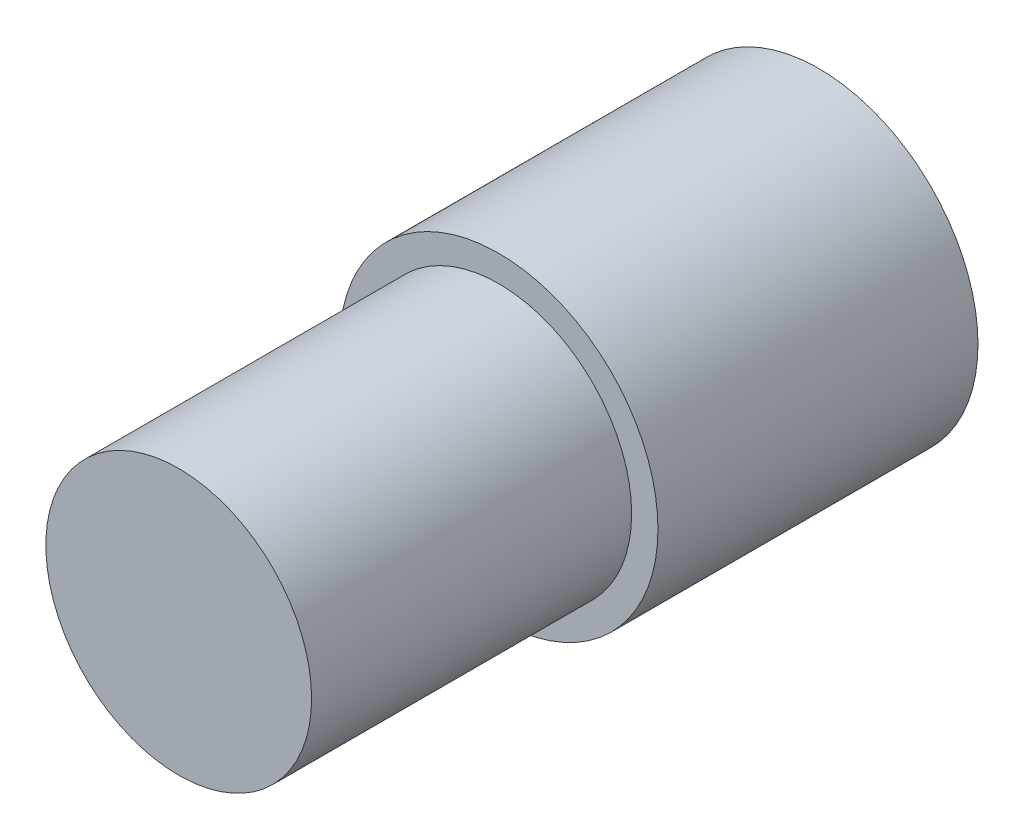
ISO-10303-21;
HEADER;
FILE_DESCRIPTION(('STEP AP214'),'2;1');
FILE_NAME('part.step','',(''),(''),'','','');
FILE_SCHEMA(('AUTOMOTIVE_DESIGN { 1 0 10303 214 1 1 1 1 }'));
ENDSEC;
DATA;
#1=APPLICATION_CONTEXT('core data for automotive mechanical design processes');
#2=APPLICATION_PROTOCOL_DEFINITION('international standard','automotive_design',2000,#1);
#3=PRODUCT_CONTEXT('',#1,'mechanical');
#4=PRODUCT('Part','Part','',(#3));
#5=PRODUCT_RELATED_PRODUCT_CATEGORY('part','',(#4));
#6=PRODUCT_DEFINITION_FORMATION('','',#4);
#7=PRODUCT_DEFINITION_CONTEXT('part definition',#1,'design');
#8=PRODUCT_DEFINITION('design','',#6,#7);
#9=PRODUCT_DEFINITION_SHAPE('','',#8);
#10=(LENGTH_UNIT() NAMED_UNIT(*) SI_UNIT(.MILLI.,.METRE.));
#11=(NAMED_UNIT(*) PLANE_ANGLE_UNIT() SI_UNIT($,.RADIAN.));
#12=(NAMED_UNIT(*) SI_UNIT($,.STERADIAN.) SOLID_ANGLE_UNIT());
#13=UNCERTAINTY_MEASURE_WITH_UNIT(LENGTH_MEASURE(1.E-05),#10,'distance_accuracy_value','');
#14=(GEOMETRIC_REPRESENTATION_CONTEXT(3) GLOBAL_UNCERTAINTY_ASSIGNED_CONTEXT((#13)) GLOBAL_UNIT_ASSIGNED_CONTEXT((#10,
#11,#12)) REPRESENTATION_CONTEXT('',''));
#15=CARTESIAN_POINT('',(0.,0.,0.));
#16=DIRECTION('',(0.,0.,1.));
#17=DIRECTION('',(1.,0.,0.));
#18=AXIS2_PLACEMENT_3D('',#15,#16,#17);
#19=CARTESIAN_POINT('',(0.,0.,10.));
#20=DIRECTION('',(0.,0.,-1.));
#21=DIRECTION('',(-1.,0.,0.));
#22=AXIS2_PLACEMENT_3D('',#19,#20,#21);
#23=CYLINDRICAL_SURFACE('',#22,4.975);
#24=CARTESIAN_POINT('',(0.,0.,10.));
#25=DIRECTION('',(0.,0.,1.));
#26=DIRECTION('',(1.,0.,0.));
#27=AXIS2_PLACEMENT_3D('',#24,#25,#26);
#28=CIRCLE('',#27,4.975);
#29=CARTESIAN_POINT('',(4.975,0.,10.));
#30=VERTEX_POINT('',#29);
#31=EDGE_CURVE('E44',#30,#30,#28,.T.);
#32=ORIENTED_EDGE('',*,*,#31,.F.);
#33=EDGE_LOOP('',(#32));
#34=FACE_BOUND('',#33,.T.);
#35=CARTESIAN_POINT('',(0.,0.,0.));
#36=DIRECTION('',(0.,0.,1.));
#37=DIRECTION('',(1.,0.,0.));
#38=AXIS2_PLACEMENT_3D('',#35,#36,#37);
#39=CIRCLE('',#38,4.975);
#40=CARTESIAN_POINT('',(4.975,0.,0.));
#41=VERTEX_POINT('',#40);
#42=EDGE_CURVE('E40',#41,#41,#39,.T.);
#43=ORIENTED_EDGE('',*,*,#42,.T.);
#44=EDGE_LOOP('',(#43));
#45=FACE_BOUND('',#44,.T.);
#46=ADVANCED_FACE('F37',(#34,#45),#23,.T.);
#47=CARTESIAN_POINT('',(0.,0.,10.));
#48=DIRECTION('',(0.,0.,1.));
#49=DIRECTION('',(1.,0.,0.));
#50=AXIS2_PLACEMENT_3D('',#47,#48,#49);
#51=PLANE('',#50);
#52=CARTESIAN_POINT('',(0.,0.,10.));
#53=DIRECTION('',(0.,0.,1.));
#54=DIRECTION('',(1.,0.,0.));
#55=AXIS2_PLACEMENT_3D('',#52,#53,#54);
#56=CIRCLE('',#55,4.1520075664446);
#57=CARTESIAN_POINT('',(4.1520075664446,0.,10.));
#58=VERTEX_POINT('',#57);
#59=EDGE_CURVE('E10',#58,#58,#56,.T.);
#60=ORIENTED_EDGE('',*,*,#59,.F.);
#61=EDGE_LOOP('',(#60));
#62=FACE_BOUND('',#61,.T.);
#63=ORIENTED_EDGE('',*,*,#31,.T.);
#64=EDGE_LOOP('',(#63));
#65=FACE_BOUND('',#64,.T.);
#66=ADVANCED_FACE('F61',(#62,#65),#51,.T.);
#67=CARTESIAN_POINT('',(0.,0.,0.));
#68=DIRECTION('',(0.,0.,1.));
#69=DIRECTION('',(1.,0.,0.));
#70=AXIS2_PLACEMENT_3D('',#67,#68,#69);
#71=PLANE('',#70);
#72=ORIENTED_EDGE('',*,*,#42,.F.);
#73=EDGE_LOOP('',(#72));
#74=FACE_BOUND('',#73,.T.);
#75=ADVANCED_FACE('F58',(#74),#71,.F.);
#76=CARTESIAN_POINT('',(0.,0.,20.));
#77=DIRECTION('',(0.,0.,-1.));
#78=DIRECTION('',(-1.,0.,0.));
#79=AXIS2_PLACEMENT_3D('',#76,#77,#78);
#80=CYLINDRICAL_SURFACE('',#79,4.1520075664446);
#81=CARTESIAN_POINT('',(0.,0.,20.));
#82=DIRECTION('',(0.,0.,1.));
#83=DIRECTION('',(1.,0.,0.));
#84=AXIS2_PLACEMENT_3D('',#81,#82,#83);
#85=CIRCLE('',#84,4.1520075664446);
#86=CARTESIAN_POINT('',(4.1520075664446,0.,20.));
#87=VERTEX_POINT('',#86);
#88=EDGE_CURVE('E50',#87,#87,#85,.T.);
#89=ORIENTED_EDGE('',*,*,#88,.F.);
#90=EDGE_LOOP('',(#89));
#91=FACE_BOUND('',#90,.T.);
#92=ORIENTED_EDGE('',*,*,#59,.T.);
#93=EDGE_LOOP('',(#92));
#94=FACE_BOUND('',#93,.T.);
#95=ADVANCED_FACE('F60',(#91,#94),#80,.T.);
#96=CARTESIAN_POINT('',(0.,0.,20.));
#97=DIRECTION('',(0.,0.,1.));
#98=DIRECTION('',(1.,0.,0.));
#99=AXIS2_PLACEMENT_3D('',#96,#97,#98);
#100=PLANE('',#99);
#101=ORIENTED_EDGE('',*,*,#88,.T.);
#102=EDGE_LOOP('',(#101));
#103=FACE_BOUND('',#102,.T.);
#104=ADVANCED_FACE('F66',(#103),#100,.T.);
#105=CLOSED_SHELL('',(#46,#66,#75,#95,#104));
#106=MANIFOLD_SOLID_BREP('B2',#105);
#107=ADVANCED_BREP_SHAPE_REPRESENTATION('',(#18,#106),#14);
#108=SHAPE_DEFINITION_REPRESENTATION(#9,#107);
ENDSEC;
END-ISO-10303-21;
